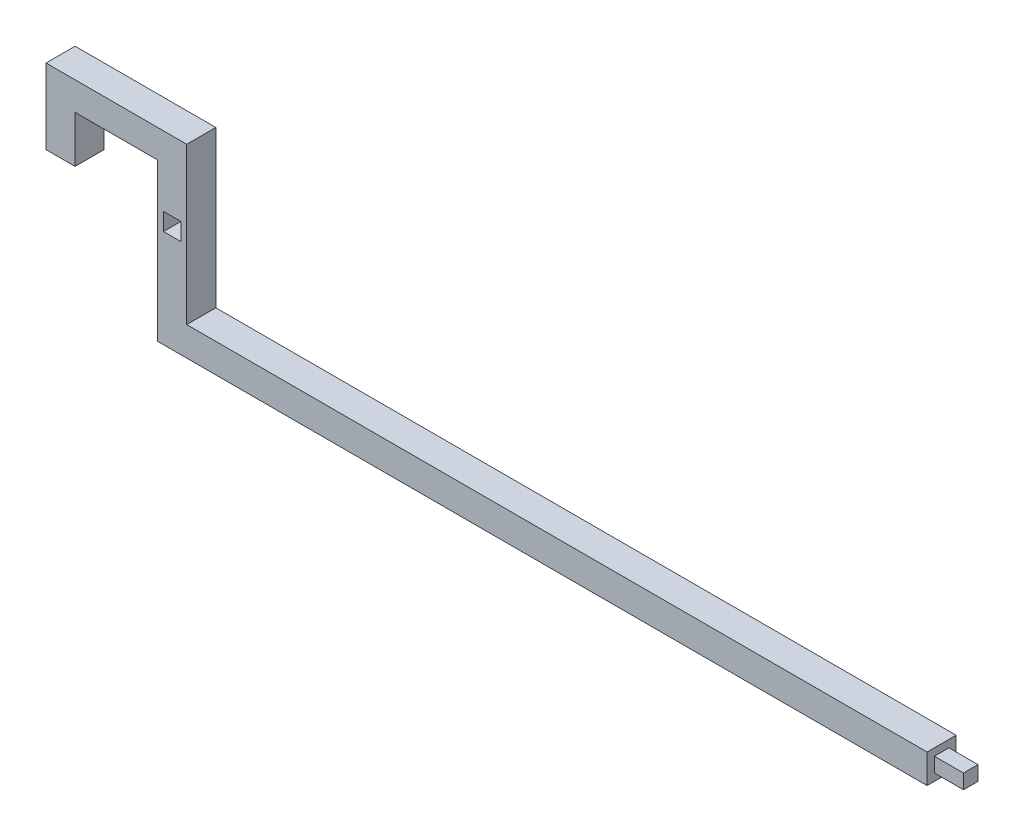
ISO-10303-21;
HEADER;
FILE_DESCRIPTION(('STEP AP214'),'2;1');
FILE_NAME('part.step','',(''),(''),'','','');
FILE_SCHEMA(('AUTOMOTIVE_DESIGN { 1 0 10303 214 1 1 1 1 }'));
ENDSEC;
DATA;
#1=APPLICATION_CONTEXT('core data for automotive mechanical design processes');
#2=APPLICATION_PROTOCOL_DEFINITION('international standard','automotive_design',2000,#1);
#3=PRODUCT_CONTEXT('',#1,'mechanical');
#4=PRODUCT('Part','Part','',(#3));
#5=PRODUCT_RELATED_PRODUCT_CATEGORY('part','',(#4));
#6=PRODUCT_DEFINITION_FORMATION('','',#4);
#7=PRODUCT_DEFINITION_CONTEXT('part definition',#1,'design');
#8=PRODUCT_DEFINITION('design','',#6,#7);
#9=PRODUCT_DEFINITION_SHAPE('','',#8);
#10=(LENGTH_UNIT() NAMED_UNIT(*) SI_UNIT(.MILLI.,.METRE.));
#11=(NAMED_UNIT(*) PLANE_ANGLE_UNIT() SI_UNIT($,.RADIAN.));
#12=(NAMED_UNIT(*) SI_UNIT($,.STERADIAN.) SOLID_ANGLE_UNIT());
#13=UNCERTAINTY_MEASURE_WITH_UNIT(LENGTH_MEASURE(1.E-05),#10,'distance_accuracy_value','');
#14=(GEOMETRIC_REPRESENTATION_CONTEXT(3) GLOBAL_UNCERTAINTY_ASSIGNED_CONTEXT((#13)) GLOBAL_UNIT_ASSIGNED_CONTEXT((#10,
#11,#12)) REPRESENTATION_CONTEXT('',''));
#15=CARTESIAN_POINT('',(0.,0.,0.));
#16=DIRECTION('',(0.,0.,1.));
#17=DIRECTION('',(1.,0.,0.));
#18=AXIS2_PLACEMENT_3D('',#15,#16,#17);
#19=CARTESIAN_POINT('',(146.5,-18.95,5.));
#20=DIRECTION('',(-1.,0.,0.));
#21=DIRECTION('',(0.,0.,1.));
#22=AXIS2_PLACEMENT_3D('',#19,#20,#21);
#23=PLANE('',#22);
#24=DIRECTION('',(0.,1.,0.));
#25=VECTOR('',#24,1.);
#26=CARTESIAN_POINT('',(146.5,-18.95,0.));
#27=LINE('',#26,#25);
#28=CARTESIAN_POINT('',(146.5,-18.95,0.));
#29=VERTEX_POINT('',#28);
#30=CARTESIAN_POINT('',(146.5,-13.95,0.));
#31=VERTEX_POINT('',#30);
#32=EDGE_CURVE('E249',#29,#31,#27,.T.);
#33=ORIENTED_EDGE('',*,*,#32,.T.);
#34=DIRECTION('',(0.,0.,-1.));
#35=VECTOR('',#34,1.);
#36=CARTESIAN_POINT('',(146.5,-13.95,5.));
#37=LINE('',#36,#35);
#38=CARTESIAN_POINT('',(146.5,-13.95,5.));
#39=VERTEX_POINT('',#38);
#40=EDGE_CURVE('E276',#39,#31,#37,.T.);
#41=ORIENTED_EDGE('',*,*,#40,.F.);
#42=DIRECTION('',(0.,1.,0.));
#43=VECTOR('',#42,1.);
#44=CARTESIAN_POINT('',(146.5,-18.95,5.));
#45=LINE('',#44,#43);
#46=CARTESIAN_POINT('',(146.5,-18.95,5.));
#47=VERTEX_POINT('',#46);
#48=EDGE_CURVE('E228',#47,#39,#45,.T.);
#49=ORIENTED_EDGE('',*,*,#48,.F.);
#50=DIRECTION('',(0.,0.,-1.));
#51=VECTOR('',#50,1.);
#52=CARTESIAN_POINT('',(146.5,-18.95,5.));
#53=LINE('',#52,#51);
#54=EDGE_CURVE('E279',#47,#29,#53,.T.);
#55=ORIENTED_EDGE('',*,*,#54,.T.);
#56=EDGE_LOOP('',(#33,#41,#49,#55));
#57=FACE_BOUND('',#56,.T.);
#58=DIRECTION('',(0.,-1.,0.));
#59=VECTOR('',#58,1.);
#60=CARTESIAN_POINT('',(146.5,-17.7,3.75));
#61=LINE('',#60,#59);
#62=CARTESIAN_POINT('',(146.5,-15.2,3.75));
#63=VERTEX_POINT('',#62);
#64=CARTESIAN_POINT('',(146.5,-17.7,3.75));
#65=VERTEX_POINT('',#64);
#66=EDGE_CURVE('E183',#63,#65,#61,.T.);
#67=ORIENTED_EDGE('',*,*,#66,.F.);
#68=DIRECTION('',(0.,0.,1.));
#69=VECTOR('',#68,1.);
#70=CARTESIAN_POINT('',(146.5,-15.2,3.75));
#71=LINE('',#70,#69);
#72=CARTESIAN_POINT('',(146.5,-15.2,1.25));
#73=VERTEX_POINT('',#72);
#74=EDGE_CURVE('E190',#73,#63,#71,.T.);
#75=ORIENTED_EDGE('',*,*,#74,.F.);
#76=DIRECTION('',(0.,1.,0.));
#77=VECTOR('',#76,1.);
#78=CARTESIAN_POINT('',(146.5,-17.7,1.25));
#79=LINE('',#78,#77);
#80=CARTESIAN_POINT('',(146.5,-17.7,1.25));
#81=VERTEX_POINT('',#80);
#82=EDGE_CURVE('E202',#81,#73,#79,.T.);
#83=ORIENTED_EDGE('',*,*,#82,.F.);
#84=DIRECTION('',(0.,0.,-1.));
#85=VECTOR('',#84,1.);
#86=CARTESIAN_POINT('',(146.5,-17.7,3.75));
#87=LINE('',#86,#85);
#88=EDGE_CURVE('E199',#65,#81,#87,.T.);
#89=ORIENTED_EDGE('',*,*,#88,.F.);
#90=EDGE_LOOP('',(#67,#75,#83,#89));
#91=FACE_BOUND('',#90,.T.);
#92=ADVANCED_FACE('F33',(#57,#91),#23,.F.);
#93=CARTESIAN_POINT('',(0.,6.7,5.));
#94=DIRECTION('',(-1.,0.,0.));
#95=DIRECTION('',(0.,0.,1.));
#96=AXIS2_PLACEMENT_3D('',#93,#94,#95);
#97=PLANE('',#96);
#98=DIRECTION('',(0.,1.,0.));
#99=VECTOR('',#98,1.);
#100=CARTESIAN_POINT('',(0.,6.7,0.));
#101=LINE('',#100,#99);
#102=CARTESIAN_POINT('',(0.,0.,0.));
#103=VERTEX_POINT('',#102);
#104=CARTESIAN_POINT('',(0.,8.05,0.));
#105=VERTEX_POINT('',#104);
#106=EDGE_CURVE('E218',#103,#105,#101,.T.);
#107=ORIENTED_EDGE('',*,*,#106,.T.);
#108=DIRECTION('',(0.,0.,-1.));
#109=VECTOR('',#108,1.);
#110=CARTESIAN_POINT('',(0.,8.05,5.));
#111=LINE('',#110,#109);
#112=CARTESIAN_POINT('',(0.,8.05,5.));
#113=VERTEX_POINT('',#112);
#114=EDGE_CURVE('E288',#113,#105,#111,.T.);
#115=ORIENTED_EDGE('',*,*,#114,.F.);
#116=DIRECTION('',(0.,1.,0.));
#117=VECTOR('',#116,1.);
#118=CARTESIAN_POINT('',(0.,6.7,5.));
#119=LINE('',#118,#117);
#120=CARTESIAN_POINT('',(0.,0.,5.));
#121=VERTEX_POINT('',#120);
#122=EDGE_CURVE('E219',#121,#113,#119,.T.);
#123=ORIENTED_EDGE('',*,*,#122,.F.);
#124=DIRECTION('',(0.,0.,-1.));
#125=VECTOR('',#124,1.);
#126=CARTESIAN_POINT('',(0.,0.,5.));
#127=LINE('',#126,#125);
#128=EDGE_CURVE('E240',#121,#103,#127,.T.);
#129=ORIENTED_EDGE('',*,*,#128,.T.);
#130=EDGE_LOOP('',(#107,#115,#123,#129));
#131=FACE_BOUND('',#130,.T.);
#132=ADVANCED_FACE('F35',(#131),#97,.F.);
#133=CARTESIAN_POINT('',(5.5,8.05,5.));
#134=DIRECTION('',(0.,1.,0.));
#135=DIRECTION('',(0.,0.,1.));
#136=AXIS2_PLACEMENT_3D('',#133,#134,#135);
#137=PLANE('',#136);
#138=DIRECTION('',(1.,0.,0.));
#139=VECTOR('',#138,1.);
#140=CARTESIAN_POINT('',(5.5,8.05,0.));
#141=LINE('',#140,#139);
#142=CARTESIAN_POINT('',(14.2,8.05,0.));
#143=VERTEX_POINT('',#142);
#144=EDGE_CURVE('E243',#105,#143,#141,.T.);
#145=ORIENTED_EDGE('',*,*,#144,.T.);
#146=DIRECTION('',(0.,0.,-1.));
#147=VECTOR('',#146,1.);
#148=CARTESIAN_POINT('',(14.2,8.05,5.));
#149=LINE('',#148,#147);
#150=CARTESIAN_POINT('',(14.2,8.05,5.));
#151=VERTEX_POINT('',#150);
#152=EDGE_CURVE('E285',#151,#143,#149,.T.);
#153=ORIENTED_EDGE('',*,*,#152,.F.);
#154=DIRECTION('',(1.,0.,0.));
#155=VECTOR('',#154,1.);
#156=CARTESIAN_POINT('',(0.,8.05,5.));
#157=LINE('',#156,#155);
#158=EDGE_CURVE('E221',#113,#151,#157,.T.);
#159=ORIENTED_EDGE('',*,*,#158,.F.);
#160=ORIENTED_EDGE('',*,*,#114,.T.);
#161=EDGE_LOOP('',(#145,#153,#159,#160));
#162=FACE_BOUND('',#161,.T.);
#163=ADVANCED_FACE('F322',(#162),#137,.F.);
#164=CARTESIAN_POINT('',(14.2,8.05,5.));
#165=DIRECTION('',(1.,0.,0.));
#166=DIRECTION('',(0.,1.,0.));
#167=AXIS2_PLACEMENT_3D('',#164,#165,#166);
#168=PLANE('',#167);
#169=DIRECTION('',(0.,-1.,0.));
#170=VECTOR('',#169,1.);
#171=CARTESIAN_POINT('',(14.2,8.05,0.));
#172=LINE('',#171,#170);
#173=CARTESIAN_POINT('',(14.2,-18.95,0.));
#174=VERTEX_POINT('',#173);
#175=EDGE_CURVE('E245',#143,#174,#172,.T.);
#176=ORIENTED_EDGE('',*,*,#175,.T.);
#177=DIRECTION('',(0.,0.,-1.));
#178=VECTOR('',#177,1.);
#179=CARTESIAN_POINT('',(14.2,-18.95,5.));
#180=LINE('',#179,#178);
#181=CARTESIAN_POINT('',(14.2,-18.95,5.));
#182=VERTEX_POINT('',#181);
#183=EDGE_CURVE('E282',#182,#174,#180,.T.);
#184=ORIENTED_EDGE('',*,*,#183,.F.);
#185=DIRECTION('',(0.,-1.,0.));
#186=VECTOR('',#185,1.);
#187=CARTESIAN_POINT('',(14.2,8.05,5.));
#188=LINE('',#187,#186);
#189=EDGE_CURVE('E224',#151,#182,#188,.T.);
#190=ORIENTED_EDGE('',*,*,#189,.F.);
#191=ORIENTED_EDGE('',*,*,#152,.T.);
#192=EDGE_LOOP('',(#176,#184,#190,#191));
#193=FACE_BOUND('',#192,.T.);
#194=ADVANCED_FACE('F332',(#193),#168,.F.);
#195=CARTESIAN_POINT('',(14.2,-18.95,5.));
#196=DIRECTION('',(0.,1.,0.));
#197=DIRECTION('',(-1.,0.,0.));
#198=AXIS2_PLACEMENT_3D('',#195,#196,#197);
#199=PLANE('',#198);
#200=DIRECTION('',(1.,0.,0.));
#201=VECTOR('',#200,1.);
#202=CARTESIAN_POINT('',(14.2,-18.95,0.));
#203=LINE('',#202,#201);
#204=EDGE_CURVE('E247',#174,#29,#203,.T.);
#205=ORIENTED_EDGE('',*,*,#204,.T.);
#206=ORIENTED_EDGE('',*,*,#54,.F.);
#207=DIRECTION('',(1.,0.,0.));
#208=VECTOR('',#207,1.);
#209=CARTESIAN_POINT('',(14.2,-18.95,5.));
#210=LINE('',#209,#208);
#211=EDGE_CURVE('E226',#182,#47,#210,.T.);
#212=ORIENTED_EDGE('',*,*,#211,.F.);
#213=ORIENTED_EDGE('',*,*,#183,.T.);
#214=EDGE_LOOP('',(#205,#206,#212,#213));
#215=FACE_BOUND('',#214,.T.);
#216=ADVANCED_FACE('F329',(#215),#199,.F.);
#217=CARTESIAN_POINT('',(19.2,-13.95,5.));
#218=DIRECTION('',(0.,-1.,0.));
#219=DIRECTION('',(0.,0.,-1.));
#220=AXIS2_PLACEMENT_3D('',#217,#218,#219);
#221=PLANE('',#220);
#222=DIRECTION('',(-1.,0.,0.));
#223=VECTOR('',#222,1.);
#224=CARTESIAN_POINT('',(19.2,-13.95,0.));
#225=LINE('',#224,#223);
#226=CARTESIAN_POINT('',(19.2,-13.95,0.));
#227=VERTEX_POINT('',#226);
#228=EDGE_CURVE('E251',#31,#227,#225,.T.);
#229=ORIENTED_EDGE('',*,*,#228,.T.);
#230=DIRECTION('',(0.,0.,-1.));
#231=VECTOR('',#230,1.);
#232=CARTESIAN_POINT('',(19.2,-13.95,5.));
#233=LINE('',#232,#231);
#234=CARTESIAN_POINT('',(19.2,-13.95,5.));
#235=VERTEX_POINT('',#234);
#236=EDGE_CURVE('E273',#235,#227,#233,.T.);
#237=ORIENTED_EDGE('',*,*,#236,.F.);
#238=DIRECTION('',(-1.,0.,0.));
#239=VECTOR('',#238,1.);
#240=CARTESIAN_POINT('',(19.2,-13.95,5.));
#241=LINE('',#240,#239);
#242=EDGE_CURVE('E230',#39,#235,#241,.T.);
#243=ORIENTED_EDGE('',*,*,#242,.F.);
#244=ORIENTED_EDGE('',*,*,#40,.T.);
#245=EDGE_LOOP('',(#229,#237,#243,#244));
#246=FACE_BOUND('',#245,.T.);
#247=ADVANCED_FACE('F327',(#246),#221,.F.);
#248=CARTESIAN_POINT('',(19.2,12.9,5.));
#249=DIRECTION('',(-1.,0.,0.));
#250=DIRECTION('',(0.,-1.,0.));
#251=AXIS2_PLACEMENT_3D('',#248,#249,#250);
#252=PLANE('',#251);
#253=DIRECTION('',(0.,1.,0.));
#254=VECTOR('',#253,1.);
#255=CARTESIAN_POINT('',(19.2,12.9,0.));
#256=LINE('',#255,#254);
#257=CARTESIAN_POINT('',(19.2,12.9,0.));
#258=VERTEX_POINT('',#257);
#259=EDGE_CURVE('E253',#227,#258,#256,.T.);
#260=ORIENTED_EDGE('',*,*,#259,.T.);
#261=DIRECTION('',(0.,0.,-1.));
#262=VECTOR('',#261,1.);
#263=CARTESIAN_POINT('',(19.2,12.9,5.));
#264=LINE('',#263,#262);
#265=CARTESIAN_POINT('',(19.2,12.9,5.));
#266=VERTEX_POINT('',#265);
#267=EDGE_CURVE('E270',#266,#258,#264,.T.);
#268=ORIENTED_EDGE('',*,*,#267,.F.);
#269=DIRECTION('',(0.,1.,0.));
#270=VECTOR('',#269,1.);
#271=CARTESIAN_POINT('',(19.2,12.9,5.));
#272=LINE('',#271,#270);
#273=EDGE_CURVE('E232',#235,#266,#272,.T.);
#274=ORIENTED_EDGE('',*,*,#273,.F.);
#275=ORIENTED_EDGE('',*,*,#236,.T.);
#276=EDGE_LOOP('',(#260,#268,#274,#275));
#277=FACE_BOUND('',#276,.T.);
#278=ADVANCED_FACE('F371',(#277),#252,.F.);
#279=CARTESIAN_POINT('',(-5.,12.9,5.));
#280=DIRECTION('',(0.,-1.,0.));
#281=DIRECTION('',(0.,0.,-1.));
#282=AXIS2_PLACEMENT_3D('',#279,#280,#281);
#283=PLANE('',#282);
#284=DIRECTION('',(-1.,0.,0.));
#285=VECTOR('',#284,1.);
#286=CARTESIAN_POINT('',(-5.,12.9,0.));
#287=LINE('',#286,#285);
#288=CARTESIAN_POINT('',(-5.,12.9,0.));
#289=VERTEX_POINT('',#288);
#290=EDGE_CURVE('E256',#258,#289,#287,.T.);
#291=ORIENTED_EDGE('',*,*,#290,.T.);
#292=DIRECTION('',(0.,0.,-1.));
#293=VECTOR('',#292,1.);
#294=CARTESIAN_POINT('',(-5.,12.9,5.));
#295=LINE('',#294,#293);
#296=CARTESIAN_POINT('',(-5.,12.9,5.));
#297=VERTEX_POINT('',#296);
#298=EDGE_CURVE('E267',#297,#289,#295,.T.);
#299=ORIENTED_EDGE('',*,*,#298,.F.);
#300=DIRECTION('',(-1.,0.,0.));
#301=VECTOR('',#300,1.);
#302=CARTESIAN_POINT('',(5.5,12.9,5.));
#303=LINE('',#302,#301);
#304=EDGE_CURVE('E234',#266,#297,#303,.T.);
#305=ORIENTED_EDGE('',*,*,#304,.F.);
#306=ORIENTED_EDGE('',*,*,#267,.T.);
#307=EDGE_LOOP('',(#291,#299,#305,#306));
#308=FACE_BOUND('',#307,.T.);
#309=ADVANCED_FACE('F374',(#308),#283,.F.);
#310=CARTESIAN_POINT('',(-5.,0.,5.));
#311=DIRECTION('',(1.,0.,0.));
#312=DIRECTION('',(0.,0.,-1.));
#313=AXIS2_PLACEMENT_3D('',#310,#311,#312);
#314=PLANE('',#313);
#315=DIRECTION('',(0.,-1.,0.));
#316=VECTOR('',#315,1.);
#317=CARTESIAN_POINT('',(-5.,0.,0.));
#318=LINE('',#317,#316);
#319=CARTESIAN_POINT('',(-5.,0.,0.));
#320=VERTEX_POINT('',#319);
#321=EDGE_CURVE('E258',#289,#320,#318,.T.);
#322=ORIENTED_EDGE('',*,*,#321,.T.);
#323=DIRECTION('',(0.,0.,-1.));
#324=VECTOR('',#323,1.);
#325=CARTESIAN_POINT('',(-5.,0.,5.));
#326=LINE('',#325,#324);
#327=CARTESIAN_POINT('',(-5.,0.,5.));
#328=VERTEX_POINT('',#327);
#329=EDGE_CURVE('E264',#328,#320,#326,.T.);
#330=ORIENTED_EDGE('',*,*,#329,.F.);
#331=DIRECTION('',(0.,-1.,0.));
#332=VECTOR('',#331,1.);
#333=CARTESIAN_POINT('',(-5.,0.,5.));
#334=LINE('',#333,#332);
#335=EDGE_CURVE('E236',#297,#328,#334,.T.);
#336=ORIENTED_EDGE('',*,*,#335,.F.);
#337=ORIENTED_EDGE('',*,*,#298,.T.);
#338=EDGE_LOOP('',(#322,#330,#336,#337));
#339=FACE_BOUND('',#338,.T.);
#340=ADVANCED_FACE('F365',(#339),#314,.F.);
#341=CARTESIAN_POINT('',(0.,0.,5.));
#342=DIRECTION('',(0.,1.,0.));
#343=DIRECTION('',(-1.,0.,0.));
#344=AXIS2_PLACEMENT_3D('',#341,#342,#343);
#345=PLANE('',#344);
#346=DIRECTION('',(1.,0.,0.));
#347=VECTOR('',#346,1.);
#348=CARTESIAN_POINT('',(0.,0.,0.));
#349=LINE('',#348,#347);
#350=EDGE_CURVE('E222',#320,#103,#349,.T.);
#351=ORIENTED_EDGE('',*,*,#350,.T.);
#352=ORIENTED_EDGE('',*,*,#128,.F.);
#353=DIRECTION('',(1.,0.,0.));
#354=VECTOR('',#353,1.);
#355=CARTESIAN_POINT('',(0.,0.,5.));
#356=LINE('',#355,#354);
#357=EDGE_CURVE('E238',#328,#121,#356,.T.);
#358=ORIENTED_EDGE('',*,*,#357,.F.);
#359=ORIENTED_EDGE('',*,*,#329,.T.);
#360=EDGE_LOOP('',(#351,#352,#358,#359));
#361=FACE_BOUND('',#360,.T.);
#362=ADVANCED_FACE('F361',(#361),#345,.F.);
#363=CARTESIAN_POINT('',(0.,0.,5.));
#364=DIRECTION('',(0.,0.,-1.));
#365=DIRECTION('',(-1.,0.,0.));
#366=AXIS2_PLACEMENT_3D('',#363,#364,#365);
#367=PLANE('',#366);
#368=DIRECTION('',(1.,0.,0.));
#369=VECTOR('',#368,1.);
#370=CARTESIAN_POINT('',(15.2,-2.1,5.));
#371=LINE('',#370,#369);
#372=CARTESIAN_POINT('',(15.2,-2.1,5.));
#373=VERTEX_POINT('',#372);
#374=CARTESIAN_POINT('',(18.2,-2.1,5.));
#375=VERTEX_POINT('',#374);
#376=EDGE_CURVE('E169',#373,#375,#371,.T.);
#377=ORIENTED_EDGE('',*,*,#376,.F.);
#378=DIRECTION('',(0.,-1.,0.));
#379=VECTOR('',#378,1.);
#380=CARTESIAN_POINT('',(15.2,0.9,5.));
#381=LINE('',#380,#379);
#382=CARTESIAN_POINT('',(15.2,0.9,5.));
#383=VERTEX_POINT('',#382);
#384=EDGE_CURVE('E48',#383,#373,#381,.T.);
#385=ORIENTED_EDGE('',*,*,#384,.F.);
#386=DIRECTION('',(-1.,0.,0.));
#387=VECTOR('',#386,1.);
#388=CARTESIAN_POINT('',(15.2,0.9,5.));
#389=LINE('',#388,#387);
#390=CARTESIAN_POINT('',(18.2,0.9,5.));
#391=VERTEX_POINT('',#390);
#392=EDGE_CURVE('E176',#391,#383,#389,.T.);
#393=ORIENTED_EDGE('',*,*,#392,.F.);
#394=DIRECTION('',(0.,1.,0.));
#395=VECTOR('',#394,1.);
#396=CARTESIAN_POINT('',(18.2,0.9,5.));
#397=LINE('',#396,#395);
#398=EDGE_CURVE('E160',#375,#391,#397,.T.);
#399=ORIENTED_EDGE('',*,*,#398,.F.);
#400=EDGE_LOOP('',(#377,#385,#393,#399));
#401=FACE_BOUND('',#400,.T.);
#402=ORIENTED_EDGE('',*,*,#122,.T.);
#403=ORIENTED_EDGE('',*,*,#158,.T.);
#404=ORIENTED_EDGE('',*,*,#189,.T.);
#405=ORIENTED_EDGE('',*,*,#211,.T.);
#406=ORIENTED_EDGE('',*,*,#48,.T.);
#407=ORIENTED_EDGE('',*,*,#242,.T.);
#408=ORIENTED_EDGE('',*,*,#273,.T.);
#409=ORIENTED_EDGE('',*,*,#304,.T.);
#410=ORIENTED_EDGE('',*,*,#335,.T.);
#411=ORIENTED_EDGE('',*,*,#357,.T.);
#412=EDGE_LOOP('',(#402,#403,#404,#405,#406,#407,#408,#409,#410,#411));
#413=FACE_BOUND('',#412,.T.);
#414=ADVANCED_FACE('F173',(#401,#413),#367,.F.);
#415=CARTESIAN_POINT('',(0.,0.,0.));
#416=DIRECTION('',(0.,0.,-1.));
#417=DIRECTION('',(-1.,0.,0.));
#418=AXIS2_PLACEMENT_3D('',#415,#416,#417);
#419=PLANE('',#418);
#420=DIRECTION('',(0.,1.,0.));
#421=VECTOR('',#420,1.);
#422=CARTESIAN_POINT('',(15.2,0.,0.));
#423=LINE('',#422,#421);
#424=CARTESIAN_POINT('',(15.2,-2.1,0.));
#425=VERTEX_POINT('',#424);
#426=CARTESIAN_POINT('',(15.2,0.9,0.));
#427=VERTEX_POINT('',#426);
#428=EDGE_CURVE('E11',#425,#427,#423,.T.);
#429=ORIENTED_EDGE('',*,*,#428,.F.);
#430=DIRECTION('',(-1.,0.,0.));
#431=VECTOR('',#430,1.);
#432=CARTESIAN_POINT('',(0.,-2.1,0.));
#433=LINE('',#432,#431);
#434=CARTESIAN_POINT('',(18.2,-2.1,0.));
#435=VERTEX_POINT('',#434);
#436=EDGE_CURVE('E291',#435,#425,#433,.T.);
#437=ORIENTED_EDGE('',*,*,#436,.F.);
#438=DIRECTION('',(0.,-1.,0.));
#439=VECTOR('',#438,1.);
#440=CARTESIAN_POINT('',(18.2,0.,0.));
#441=LINE('',#440,#439);
#442=CARTESIAN_POINT('',(18.2,0.9,0.));
#443=VERTEX_POINT('',#442);
#444=EDGE_CURVE('E163',#443,#435,#441,.T.);
#445=ORIENTED_EDGE('',*,*,#444,.F.);
#446=DIRECTION('',(1.,0.,0.));
#447=VECTOR('',#446,1.);
#448=CARTESIAN_POINT('',(0.,0.9,0.));
#449=LINE('',#448,#447);
#450=EDGE_CURVE('E41',#427,#443,#449,.T.);
#451=ORIENTED_EDGE('',*,*,#450,.F.);
#452=EDGE_LOOP('',(#429,#437,#445,#451));
#453=FACE_BOUND('',#452,.T.);
#454=ORIENTED_EDGE('',*,*,#106,.F.);
#455=ORIENTED_EDGE('',*,*,#350,.F.);
#456=ORIENTED_EDGE('',*,*,#321,.F.);
#457=ORIENTED_EDGE('',*,*,#290,.F.);
#458=ORIENTED_EDGE('',*,*,#259,.F.);
#459=ORIENTED_EDGE('',*,*,#228,.F.);
#460=ORIENTED_EDGE('',*,*,#32,.F.);
#461=ORIENTED_EDGE('',*,*,#204,.F.);
#462=ORIENTED_EDGE('',*,*,#175,.F.);
#463=ORIENTED_EDGE('',*,*,#144,.F.);
#464=EDGE_LOOP('',(#454,#455,#456,#457,#458,#459,#460,#461,#462,#463));
#465=FACE_BOUND('',#464,.T.);
#466=ADVANCED_FACE('F299',(#453,#465),#419,.T.);
#467=CARTESIAN_POINT('',(151.5,-17.7,3.75));
#468=DIRECTION('',(0.,0.,-1.));
#469=DIRECTION('',(-1.,0.,0.));
#470=AXIS2_PLACEMENT_3D('',#467,#468,#469);
#471=PLANE('',#470);
#472=ORIENTED_EDGE('',*,*,#66,.T.);
#473=DIRECTION('',(-1.,0.,0.));
#474=VECTOR('',#473,1.);
#475=CARTESIAN_POINT('',(151.5,-17.7,3.75));
#476=LINE('',#475,#474);
#477=CARTESIAN_POINT('',(151.5,-17.7,3.75));
#478=VERTEX_POINT('',#477);
#479=EDGE_CURVE('E215',#478,#65,#476,.T.);
#480=ORIENTED_EDGE('',*,*,#479,.F.);
#481=DIRECTION('',(0.,-1.,0.));
#482=VECTOR('',#481,1.);
#483=CARTESIAN_POINT('',(151.5,-17.7,3.75));
#484=LINE('',#483,#482);
#485=CARTESIAN_POINT('',(151.5,-15.2,3.75));
#486=VERTEX_POINT('',#485);
#487=EDGE_CURVE('E186',#486,#478,#484,.T.);
#488=ORIENTED_EDGE('',*,*,#487,.F.);
#489=DIRECTION('',(-1.,0.,0.));
#490=VECTOR('',#489,1.);
#491=CARTESIAN_POINT('',(151.5,-15.2,3.75));
#492=LINE('',#491,#490);
#493=EDGE_CURVE('E196',#486,#63,#492,.T.);
#494=ORIENTED_EDGE('',*,*,#493,.T.);
#495=EDGE_LOOP('',(#472,#480,#488,#494));
#496=FACE_BOUND('',#495,.T.);
#497=ADVANCED_FACE('F387',(#496),#471,.F.);
#498=CARTESIAN_POINT('',(151.5,-17.7,3.75));
#499=DIRECTION('',(0.,1.,0.));
#500=DIRECTION('',(0.,0.,1.));
#501=AXIS2_PLACEMENT_3D('',#498,#499,#500);
#502=PLANE('',#501);
#503=ORIENTED_EDGE('',*,*,#88,.T.);
#504=DIRECTION('',(-1.,0.,0.));
#505=VECTOR('',#504,1.);
#506=CARTESIAN_POINT('',(151.5,-17.7,1.25));
#507=LINE('',#506,#505);
#508=CARTESIAN_POINT('',(151.5,-17.7,1.25));
#509=VERTEX_POINT('',#508);
#510=EDGE_CURVE('E212',#509,#81,#507,.T.);
#511=ORIENTED_EDGE('',*,*,#510,.F.);
#512=DIRECTION('',(0.,0.,-1.));
#513=VECTOR('',#512,1.);
#514=CARTESIAN_POINT('',(151.5,-17.7,3.75));
#515=LINE('',#514,#513);
#516=EDGE_CURVE('E189',#478,#509,#515,.T.);
#517=ORIENTED_EDGE('',*,*,#516,.F.);
#518=ORIENTED_EDGE('',*,*,#479,.T.);
#519=EDGE_LOOP('',(#503,#511,#517,#518));
#520=FACE_BOUND('',#519,.T.);
#521=ADVANCED_FACE('F392',(#520),#502,.F.);
#522=CARTESIAN_POINT('',(151.5,-17.7,1.25));
#523=DIRECTION('',(0.,0.,1.));
#524=DIRECTION('',(1.,0.,0.));
#525=AXIS2_PLACEMENT_3D('',#522,#523,#524);
#526=PLANE('',#525);
#527=ORIENTED_EDGE('',*,*,#82,.T.);
#528=DIRECTION('',(-1.,0.,0.));
#529=VECTOR('',#528,1.);
#530=CARTESIAN_POINT('',(151.5,-15.2,1.25));
#531=LINE('',#530,#529);
#532=CARTESIAN_POINT('',(151.5,-15.2,1.25));
#533=VERTEX_POINT('',#532);
#534=EDGE_CURVE('E209',#533,#73,#531,.T.);
#535=ORIENTED_EDGE('',*,*,#534,.F.);
#536=DIRECTION('',(0.,1.,0.));
#537=VECTOR('',#536,1.);
#538=CARTESIAN_POINT('',(151.5,-17.7,1.25));
#539=LINE('',#538,#537);
#540=EDGE_CURVE('E192',#509,#533,#539,.T.);
#541=ORIENTED_EDGE('',*,*,#540,.F.);
#542=ORIENTED_EDGE('',*,*,#510,.T.);
#543=EDGE_LOOP('',(#527,#535,#541,#542));
#544=FACE_BOUND('',#543,.T.);
#545=ADVANCED_FACE('F396',(#544),#526,.F.);
#546=CARTESIAN_POINT('',(151.5,-15.2,3.75));
#547=DIRECTION('',(0.,-1.,0.));
#548=DIRECTION('',(0.,0.,-1.));
#549=AXIS2_PLACEMENT_3D('',#546,#547,#548);
#550=PLANE('',#549);
#551=ORIENTED_EDGE('',*,*,#74,.T.);
#552=ORIENTED_EDGE('',*,*,#493,.F.);
#553=DIRECTION('',(0.,0.,1.));
#554=VECTOR('',#553,1.);
#555=CARTESIAN_POINT('',(151.5,-15.2,3.75));
#556=LINE('',#555,#554);
#557=EDGE_CURVE('E194',#533,#486,#556,.T.);
#558=ORIENTED_EDGE('',*,*,#557,.F.);
#559=ORIENTED_EDGE('',*,*,#534,.T.);
#560=EDGE_LOOP('',(#551,#552,#558,#559));
#561=FACE_BOUND('',#560,.T.);
#562=ADVANCED_FACE('F310',(#561),#550,.F.);
#563=CARTESIAN_POINT('',(151.5,0.,0.));
#564=DIRECTION('',(-1.,0.,0.));
#565=DIRECTION('',(0.,0.,1.));
#566=AXIS2_PLACEMENT_3D('',#563,#564,#565);
#567=PLANE('',#566);
#568=ORIENTED_EDGE('',*,*,#487,.T.);
#569=ORIENTED_EDGE('',*,*,#516,.T.);
#570=ORIENTED_EDGE('',*,*,#540,.T.);
#571=ORIENTED_EDGE('',*,*,#557,.T.);
#572=EDGE_LOOP('',(#568,#569,#570,#571));
#573=FACE_BOUND('',#572,.T.);
#574=ADVANCED_FACE('F303',(#573),#567,.F.);
#575=CARTESIAN_POINT('',(15.2,0.9,-5.));
#576=DIRECTION('',(-1.,0.,0.));
#577=DIRECTION('',(0.,0.,1.));
#578=AXIS2_PLACEMENT_3D('',#575,#576,#577);
#579=PLANE('',#578);
#580=ORIENTED_EDGE('',*,*,#428,.T.);
#581=DIRECTION('',(0.,0.,1.));
#582=VECTOR('',#581,1.);
#583=CARTESIAN_POINT('',(15.2,0.9,-5.));
#584=LINE('',#583,#582);
#585=EDGE_CURVE('E181',#427,#383,#584,.T.);
#586=ORIENTED_EDGE('',*,*,#585,.T.);
#587=ORIENTED_EDGE('',*,*,#384,.T.);
#588=DIRECTION('',(0.,0.,1.));
#589=VECTOR('',#588,1.);
#590=CARTESIAN_POINT('',(15.2,-2.1,-5.));
#591=LINE('',#590,#589);
#592=EDGE_CURVE('E166',#425,#373,#591,.T.);
#593=ORIENTED_EDGE('',*,*,#592,.F.);
#594=EDGE_LOOP('',(#580,#586,#587,#593));
#595=FACE_BOUND('',#594,.T.);
#596=ADVANCED_FACE('F301',(#595),#579,.F.);
#597=CARTESIAN_POINT('',(15.2,0.9,-5.));
#598=DIRECTION('',(0.,1.,0.));
#599=DIRECTION('',(0.,0.,1.));
#600=AXIS2_PLACEMENT_3D('',#597,#598,#599);
#601=PLANE('',#600);
#602=ORIENTED_EDGE('',*,*,#450,.T.);
#603=DIRECTION('',(0.,0.,1.));
#604=VECTOR('',#603,1.);
#605=CARTESIAN_POINT('',(18.2,0.9,-5.));
#606=LINE('',#605,#604);
#607=EDGE_CURVE('E165',#443,#391,#606,.T.);
#608=ORIENTED_EDGE('',*,*,#607,.T.);
#609=ORIENTED_EDGE('',*,*,#392,.T.);
#610=ORIENTED_EDGE('',*,*,#585,.F.);
#611=EDGE_LOOP('',(#602,#608,#609,#610));
#612=FACE_BOUND('',#611,.T.);
#613=ADVANCED_FACE('F296',(#612),#601,.F.);
#614=CARTESIAN_POINT('',(18.2,0.9,-5.));
#615=DIRECTION('',(1.,0.,0.));
#616=DIRECTION('',(0.,0.,-1.));
#617=AXIS2_PLACEMENT_3D('',#614,#615,#616);
#618=PLANE('',#617);
#619=ORIENTED_EDGE('',*,*,#444,.T.);
#620=DIRECTION('',(0.,0.,1.));
#621=VECTOR('',#620,1.);
#622=CARTESIAN_POINT('',(18.2,-2.1,-5.));
#623=LINE('',#622,#621);
#624=EDGE_CURVE('E56',#435,#375,#623,.T.);
#625=ORIENTED_EDGE('',*,*,#624,.T.);
#626=ORIENTED_EDGE('',*,*,#398,.T.);
#627=ORIENTED_EDGE('',*,*,#607,.F.);
#628=EDGE_LOOP('',(#619,#625,#626,#627));
#629=FACE_BOUND('',#628,.T.);
#630=ADVANCED_FACE('F157',(#629),#618,.F.);
#631=CARTESIAN_POINT('',(15.2,-2.1,-5.));
#632=DIRECTION('',(0.,-1.,0.));
#633=DIRECTION('',(0.,0.,-1.));
#634=AXIS2_PLACEMENT_3D('',#631,#632,#633);
#635=PLANE('',#634);
#636=ORIENTED_EDGE('',*,*,#436,.T.);
#637=ORIENTED_EDGE('',*,*,#592,.T.);
#638=ORIENTED_EDGE('',*,*,#376,.T.);
#639=ORIENTED_EDGE('',*,*,#624,.F.);
#640=EDGE_LOOP('',(#636,#637,#638,#639));
#641=FACE_BOUND('',#640,.T.);
#642=ADVANCED_FACE('F170',(#641),#635,.F.);
#643=CLOSED_SHELL('',(#92,#132,#163,#194,#216,#247,#278,#309,#340,#362,#414,#466,#497,#521,#545,
#562,#574,#596,#613,#630,#642));
#644=MANIFOLD_SOLID_BREP('B2',#643);
#645=ADVANCED_BREP_SHAPE_REPRESENTATION('',(#18,#644),#14);
#646=SHAPE_DEFINITION_REPRESENTATION(#9,#645);
ENDSEC;
END-ISO-10303-21;
